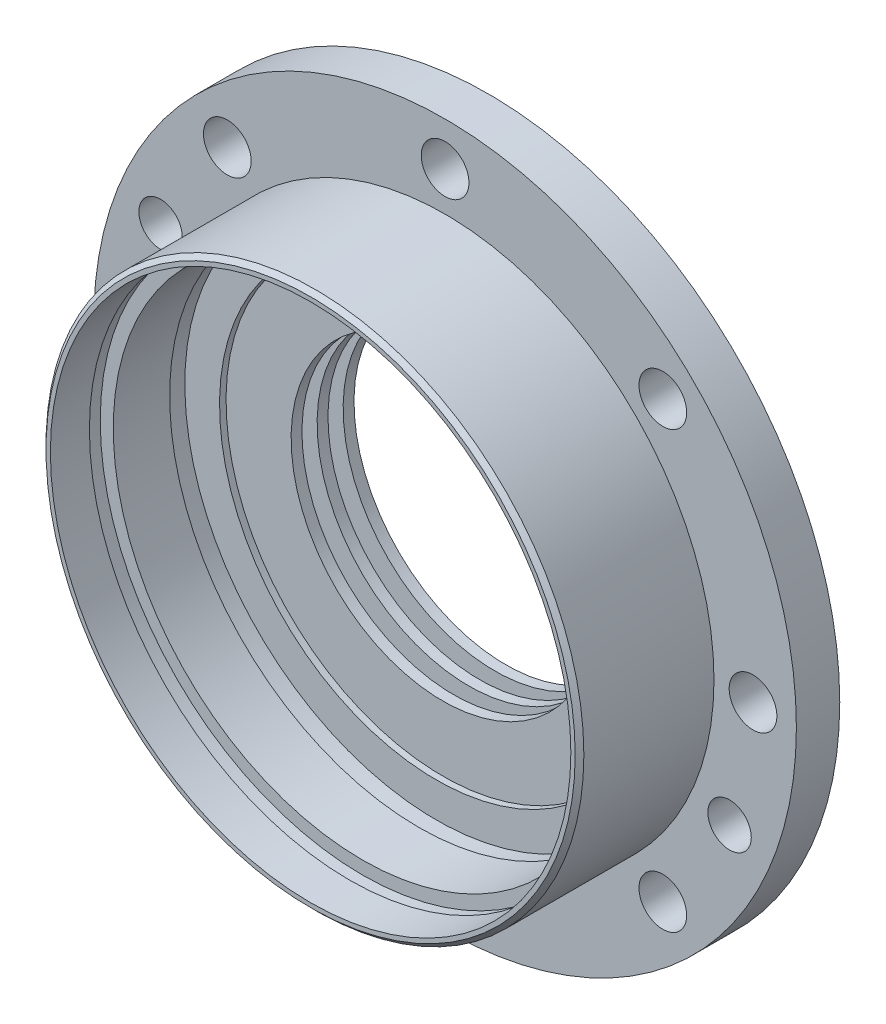
ISO-10303-21;
HEADER;
FILE_DESCRIPTION(('STEP AP214'),'2;1');
FILE_NAME('part.step','',(''),(''),'','','');
FILE_SCHEMA(('AUTOMOTIVE_DESIGN { 1 0 10303 214 1 1 1 1 }'));
ENDSEC;
DATA;
#1=APPLICATION_CONTEXT('core data for automotive mechanical design processes');
#2=APPLICATION_PROTOCOL_DEFINITION('international standard','automotive_design',2000,#1);
#3=PRODUCT_CONTEXT('',#1,'mechanical');
#4=PRODUCT('Part','Part','',(#3));
#5=PRODUCT_RELATED_PRODUCT_CATEGORY('part','',(#4));
#6=PRODUCT_DEFINITION_FORMATION('','',#4);
#7=PRODUCT_DEFINITION_CONTEXT('part definition',#1,'design');
#8=PRODUCT_DEFINITION('design','',#6,#7);
#9=PRODUCT_DEFINITION_SHAPE('','',#8);
#10=(LENGTH_UNIT() NAMED_UNIT(*) SI_UNIT(.MILLI.,.METRE.));
#11=(NAMED_UNIT(*) PLANE_ANGLE_UNIT() SI_UNIT($,.RADIAN.));
#12=(NAMED_UNIT(*) SI_UNIT($,.STERADIAN.) SOLID_ANGLE_UNIT());
#13=UNCERTAINTY_MEASURE_WITH_UNIT(LENGTH_MEASURE(1.E-05),#10,'distance_accuracy_value','');
#14=(GEOMETRIC_REPRESENTATION_CONTEXT(3) GLOBAL_UNCERTAINTY_ASSIGNED_CONTEXT((#13)) GLOBAL_UNIT_ASSIGNED_CONTEXT((#10,
#11,#12)) REPRESENTATION_CONTEXT('',''));
#15=CARTESIAN_POINT('',(0.,0.,0.));
#16=DIRECTION('',(0.,0.,1.));
#17=DIRECTION('',(1.,0.,0.));
#18=AXIS2_PLACEMENT_3D('',#15,#16,#17);
#19=CARTESIAN_POINT('',(0.,0.,4.));
#20=DIRECTION('',(0.,0.,-1.));
#21=DIRECTION('',(-1.,0.,0.));
#22=AXIS2_PLACEMENT_3D('',#19,#20,#21);
#23=CYLINDRICAL_SURFACE('',#22,55.);
#24=CARTESIAN_POINT('',(0.,0.,4.));
#25=DIRECTION('',(0.,0.,1.));
#26=DIRECTION('',(1.,0.,0.));
#27=AXIS2_PLACEMENT_3D('',#24,#25,#26);
#28=CIRCLE('',#27,55.);
#29=CARTESIAN_POINT('',(55.,0.,4.));
#30=VERTEX_POINT('',#29);
#31=EDGE_CURVE('E51',#30,#30,#28,.T.);
#32=ORIENTED_EDGE('',*,*,#31,.F.);
#33=EDGE_LOOP('',(#32));
#34=FACE_BOUND('',#33,.T.);
#35=CARTESIAN_POINT('',(0.,0.,0.));
#36=DIRECTION('',(0.,0.,1.));
#37=DIRECTION('',(1.,0.,0.));
#38=AXIS2_PLACEMENT_3D('',#35,#36,#37);
#39=CIRCLE('',#38,55.);
#40=CARTESIAN_POINT('',(55.,0.,0.));
#41=VERTEX_POINT('',#40);
#42=EDGE_CURVE('E55',#41,#41,#39,.T.);
#43=ORIENTED_EDGE('',*,*,#42,.T.);
#44=EDGE_LOOP('',(#43));
#45=FACE_BOUND('',#44,.T.);
#46=ADVANCED_FACE('F39',(#34,#45),#23,.T.);
#47=CARTESIAN_POINT('',(0.,0.,0.));
#48=DIRECTION('',(0.,0.,1.));
#49=DIRECTION('',(1.,0.,0.));
#50=AXIS2_PLACEMENT_3D('',#47,#48,#49);
#51=PLANE('',#50);
#52=CARTESIAN_POINT('',(0.,0.,0.));
#53=DIRECTION('',(0.,0.,-1.));
#54=DIRECTION('',(0.,1.,0.));
#55=AXIS2_PLACEMENT_3D('',#52,#53,#54);
#56=CIRCLE('',#55,35.);
#57=CARTESIAN_POINT('',(0.,35.,0.));
#58=VERTEX_POINT('',#57);
#59=EDGE_CURVE('E126',#58,#58,#56,.T.);
#60=ORIENTED_EDGE('',*,*,#59,.F.);
#61=EDGE_LOOP('',(#60));
#62=FACE_BOUND('',#61,.T.);
#63=ORIENTED_EDGE('',*,*,#42,.F.);
#64=EDGE_LOOP('',(#63));
#65=FACE_BOUND('',#64,.T.);
#66=ADVANCED_FACE('F222',(#62,#65),#51,.F.);
#67=CARTESIAN_POINT('',(0.,0.,14.));
#68=DIRECTION('',(0.,0.,-1.));
#69=DIRECTION('',(-1.,0.,0.));
#70=AXIS2_PLACEMENT_3D('',#67,#68,#69);
#71=CYLINDRICAL_SURFACE('',#70,81.);
#72=CARTESIAN_POINT('',(0.,0.,14.));
#73=DIRECTION('',(0.,0.,1.));
#74=DIRECTION('',(1.,0.,0.));
#75=AXIS2_PLACEMENT_3D('',#72,#73,#74);
#76=CIRCLE('',#75,81.);
#77=CARTESIAN_POINT('',(81.,0.,14.));
#78=VERTEX_POINT('',#77);
#79=EDGE_CURVE('E59',#78,#78,#76,.T.);
#80=ORIENTED_EDGE('',*,*,#79,.F.);
#81=EDGE_LOOP('',(#80));
#82=FACE_BOUND('',#81,.T.);
#83=CARTESIAN_POINT('',(0.,0.,4.));
#84=DIRECTION('',(0.,0.,1.));
#85=DIRECTION('',(1.,0.,0.));
#86=AXIS2_PLACEMENT_3D('',#83,#84,#85);
#87=CIRCLE('',#86,81.);
#88=CARTESIAN_POINT('',(81.,0.,4.));
#89=VERTEX_POINT('',#88);
#90=EDGE_CURVE('E61',#89,#89,#87,.T.);
#91=ORIENTED_EDGE('',*,*,#90,.T.);
#92=EDGE_LOOP('',(#91));
#93=FACE_BOUND('',#92,.T.);
#94=ADVANCED_FACE('F196',(#82,#93),#71,.T.);
#95=CARTESIAN_POINT('',(0.,0.,14.));
#96=DIRECTION('',(0.,0.,1.));
#97=DIRECTION('',(1.,0.,0.));
#98=AXIS2_PLACEMENT_3D('',#95,#96,#97);
#99=PLANE('',#98);
#100=CARTESIAN_POINT('',(65.5954468083016,-27.170523697921,14.));
#101=DIRECTION('',(0.,0.,1.));
#102=DIRECTION('',(1.,0.,0.));
#103=AXIS2_PLACEMENT_3D('',#100,#101,#102);
#104=CIRCLE('',#103,5.00000000000002);
#105=CARTESIAN_POINT('',(70.5954468083016,-27.170523697921,14.));
#106=VERTEX_POINT('',#105);
#107=EDGE_CURVE('E186',#106,#106,#104,.T.);
#108=ORIENTED_EDGE('',*,*,#107,.F.);
#109=EDGE_LOOP('',(#108));
#110=FACE_BOUND('',#109,.T.);
#111=CARTESIAN_POINT('',(-65.5954468083015,27.170523697921,14.));
#112=DIRECTION('',(0.,0.,1.));
#113=DIRECTION('',(1.,0.,0.));
#114=AXIS2_PLACEMENT_3D('',#111,#112,#113);
#115=CIRCLE('',#114,5.00000000000001);
#116=CARTESIAN_POINT('',(-60.5954468083015,27.170523697921,14.));
#117=VERTEX_POINT('',#116);
#118=EDGE_CURVE('E180',#117,#117,#115,.T.);
#119=ORIENTED_EDGE('',*,*,#118,.F.);
#120=EDGE_LOOP('',(#119));
#121=FACE_BOUND('',#120,.T.);
#122=CARTESIAN_POINT('',(-50.2045814642455,50.2045814642443,14.));
#123=DIRECTION('',(0.,0.,1.));
#124=DIRECTION('',(1.,0.,0.));
#125=AXIS2_PLACEMENT_3D('',#122,#123,#124);
#126=CIRCLE('',#125,5.50000000000001);
#127=CARTESIAN_POINT('',(-44.7045814642455,50.2045814642443,14.));
#128=VERTEX_POINT('',#127);
#129=EDGE_CURVE('E174',#128,#128,#126,.T.);
#130=ORIENTED_EDGE('',*,*,#129,.F.);
#131=EDGE_LOOP('',(#130));
#132=FACE_BOUND('',#131,.T.);
#133=CARTESIAN_POINT('',(-7.43685525173587E-13,71.,14.));
#134=DIRECTION('',(0.,0.,1.));
#135=DIRECTION('',(1.,0.,0.));
#136=AXIS2_PLACEMENT_3D('',#133,#134,#135);
#137=CIRCLE('',#136,5.50000000000001);
#138=CARTESIAN_POINT('',(5.49999999999927,71.,14.));
#139=VERTEX_POINT('',#138);
#140=EDGE_CURVE('E168',#139,#139,#137,.T.);
#141=ORIENTED_EDGE('',*,*,#140,.F.);
#142=EDGE_LOOP('',(#141));
#143=FACE_BOUND('',#142,.T.);
#144=CARTESIAN_POINT('',(50.2045814642444,50.2045814642453,14.));
#145=DIRECTION('',(0.,0.,1.));
#146=DIRECTION('',(1.,0.,0.));
#147=AXIS2_PLACEMENT_3D('',#144,#145,#146);
#148=CIRCLE('',#147,5.50000000000001);
#149=CARTESIAN_POINT('',(55.7045814642444,50.2045814642453,14.));
#150=VERTEX_POINT('',#149);
#151=EDGE_CURVE('E162',#150,#150,#148,.T.);
#152=ORIENTED_EDGE('',*,*,#151,.F.);
#153=EDGE_LOOP('',(#152));
#154=FACE_BOUND('',#153,.T.);
#155=CARTESIAN_POINT('',(71.,0.,14.));
#156=DIRECTION('',(0.,0.,1.));
#157=DIRECTION('',(1.,0.,0.));
#158=AXIS2_PLACEMENT_3D('',#155,#156,#157);
#159=CIRCLE('',#158,5.50000000000002);
#160=CARTESIAN_POINT('',(76.5,0.,14.));
#161=VERTEX_POINT('',#160);
#162=EDGE_CURVE('E156',#161,#161,#159,.T.);
#163=ORIENTED_EDGE('',*,*,#162,.F.);
#164=EDGE_LOOP('',(#163));
#165=FACE_BOUND('',#164,.T.);
#166=CARTESIAN_POINT('',(50.2045814642451,-50.2045814642446,14.));
#167=DIRECTION('',(0.,0.,1.));
#168=DIRECTION('',(1.,0.,0.));
#169=AXIS2_PLACEMENT_3D('',#166,#167,#168);
#170=CIRCLE('',#169,5.50000000000001);
#171=CARTESIAN_POINT('',(55.7045814642451,-50.2045814642446,14.));
#172=VERTEX_POINT('',#171);
#173=EDGE_CURVE('E150',#172,#172,#170,.T.);
#174=ORIENTED_EDGE('',*,*,#173,.F.);
#175=EDGE_LOOP('',(#174));
#176=FACE_BOUND('',#175,.T.);
#177=CARTESIAN_POINT('',(2.47895175057862E-13,-71.,14.));
#178=DIRECTION('',(0.,0.,1.));
#179=DIRECTION('',(1.,0.,0.));
#180=AXIS2_PLACEMENT_3D('',#177,#178,#179);
#181=CIRCLE('',#180,5.50000000000001);
#182=CARTESIAN_POINT('',(5.50000000000026,-71.,14.));
#183=VERTEX_POINT('',#182);
#184=EDGE_CURVE('E144',#183,#183,#181,.T.);
#185=ORIENTED_EDGE('',*,*,#184,.F.);
#186=EDGE_LOOP('',(#185));
#187=FACE_BOUND('',#186,.T.);
#188=CARTESIAN_POINT('',(-50.2045814642448,-50.204581464245,14.));
#189=DIRECTION('',(0.,0.,1.));
#190=DIRECTION('',(1.,0.,0.));
#191=AXIS2_PLACEMENT_3D('',#188,#189,#190);
#192=CIRCLE('',#191,5.50000000000001);
#193=CARTESIAN_POINT('',(-44.7045814642448,-50.204581464245,14.));
#194=VERTEX_POINT('',#193);
#195=EDGE_CURVE('E138',#194,#194,#192,.T.);
#196=ORIENTED_EDGE('',*,*,#195,.F.);
#197=EDGE_LOOP('',(#196));
#198=FACE_BOUND('',#197,.T.);
#199=CARTESIAN_POINT('',(-71.,0.,14.));
#200=DIRECTION('',(0.,0.,1.));
#201=DIRECTION('',(1.,0.,0.));
#202=AXIS2_PLACEMENT_3D('',#199,#200,#201);
#203=CIRCLE('',#202,5.50000000000002);
#204=CARTESIAN_POINT('',(-65.5,0.,14.));
#205=VERTEX_POINT('',#204);
#206=EDGE_CURVE('E132',#205,#205,#203,.T.);
#207=ORIENTED_EDGE('',*,*,#206,.F.);
#208=EDGE_LOOP('',(#207));
#209=FACE_BOUND('',#208,.T.);
#210=CARTESIAN_POINT('',(0.,0.,14.));
#211=DIRECTION('',(0.,0.,1.));
#212=DIRECTION('',(1.,0.,0.));
#213=AXIS2_PLACEMENT_3D('',#210,#211,#212);
#214=CIRCLE('',#213,62.);
#215=CARTESIAN_POINT('',(62.,0.,14.));
#216=VERTEX_POINT('',#215);
#217=EDGE_CURVE('E64',#216,#216,#214,.F.);
#218=ORIENTED_EDGE('',*,*,#217,.T.);
#219=EDGE_LOOP('',(#218));
#220=FACE_BOUND('',#219,.T.);
#221=ORIENTED_EDGE('',*,*,#79,.T.);
#222=EDGE_LOOP('',(#221));
#223=FACE_BOUND('',#222,.T.);
#224=ADVANCED_FACE('F192',(#110,#121,#132,#143,#154,#165,#176,#187,#198,#209,#220,#223),#99,.T.);
#225=CARTESIAN_POINT('',(0.,0.,4.));
#226=DIRECTION('',(0.,0.,1.));
#227=DIRECTION('',(1.,0.,0.));
#228=AXIS2_PLACEMENT_3D('',#225,#226,#227);
#229=PLANE('',#228);
#230=CARTESIAN_POINT('',(65.5954468083016,-27.170523697921,4.));
#231=DIRECTION('',(0.,0.,1.));
#232=DIRECTION('',(1.,0.,0.));
#233=AXIS2_PLACEMENT_3D('',#230,#231,#232);
#234=CIRCLE('',#233,5.00000000000002);
#235=CARTESIAN_POINT('',(70.5954468083016,-27.170523697921,4.));
#236=VERTEX_POINT('',#235);
#237=EDGE_CURVE('E183',#236,#236,#234,.T.);
#238=ORIENTED_EDGE('',*,*,#237,.T.);
#239=EDGE_LOOP('',(#238));
#240=FACE_BOUND('',#239,.T.);
#241=CARTESIAN_POINT('',(-65.5954468083015,27.170523697921,4.));
#242=DIRECTION('',(0.,0.,1.));
#243=DIRECTION('',(1.,0.,0.));
#244=AXIS2_PLACEMENT_3D('',#241,#242,#243);
#245=CIRCLE('',#244,5.00000000000001);
#246=CARTESIAN_POINT('',(-60.5954468083015,27.170523697921,4.));
#247=VERTEX_POINT('',#246);
#248=EDGE_CURVE('E177',#247,#247,#245,.T.);
#249=ORIENTED_EDGE('',*,*,#248,.T.);
#250=EDGE_LOOP('',(#249));
#251=FACE_BOUND('',#250,.T.);
#252=CARTESIAN_POINT('',(-50.2045814642455,50.2045814642443,4.));
#253=DIRECTION('',(0.,0.,1.));
#254=DIRECTION('',(1.,0.,0.));
#255=AXIS2_PLACEMENT_3D('',#252,#253,#254);
#256=CIRCLE('',#255,5.50000000000001);
#257=CARTESIAN_POINT('',(-44.7045814642455,50.2045814642443,4.));
#258=VERTEX_POINT('',#257);
#259=EDGE_CURVE('E171',#258,#258,#256,.T.);
#260=ORIENTED_EDGE('',*,*,#259,.T.);
#261=EDGE_LOOP('',(#260));
#262=FACE_BOUND('',#261,.T.);
#263=CARTESIAN_POINT('',(-7.43685525173587E-13,71.,4.));
#264=DIRECTION('',(0.,0.,1.));
#265=DIRECTION('',(1.,0.,0.));
#266=AXIS2_PLACEMENT_3D('',#263,#264,#265);
#267=CIRCLE('',#266,5.50000000000001);
#268=CARTESIAN_POINT('',(5.49999999999927,71.,4.));
#269=VERTEX_POINT('',#268);
#270=EDGE_CURVE('E165',#269,#269,#267,.T.);
#271=ORIENTED_EDGE('',*,*,#270,.T.);
#272=EDGE_LOOP('',(#271));
#273=FACE_BOUND('',#272,.T.);
#274=CARTESIAN_POINT('',(50.2045814642444,50.2045814642453,4.));
#275=DIRECTION('',(0.,0.,1.));
#276=DIRECTION('',(1.,0.,0.));
#277=AXIS2_PLACEMENT_3D('',#274,#275,#276);
#278=CIRCLE('',#277,5.50000000000001);
#279=CARTESIAN_POINT('',(55.7045814642444,50.2045814642453,4.));
#280=VERTEX_POINT('',#279);
#281=EDGE_CURVE('E159',#280,#280,#278,.T.);
#282=ORIENTED_EDGE('',*,*,#281,.T.);
#283=EDGE_LOOP('',(#282));
#284=FACE_BOUND('',#283,.T.);
#285=CARTESIAN_POINT('',(71.,0.,4.));
#286=DIRECTION('',(0.,0.,1.));
#287=DIRECTION('',(1.,0.,0.));
#288=AXIS2_PLACEMENT_3D('',#285,#286,#287);
#289=CIRCLE('',#288,5.50000000000002);
#290=CARTESIAN_POINT('',(76.5,0.,4.));
#291=VERTEX_POINT('',#290);
#292=EDGE_CURVE('E153',#291,#291,#289,.T.);
#293=ORIENTED_EDGE('',*,*,#292,.T.);
#294=EDGE_LOOP('',(#293));
#295=FACE_BOUND('',#294,.T.);
#296=CARTESIAN_POINT('',(50.2045814642451,-50.2045814642446,4.));
#297=DIRECTION('',(0.,0.,1.));
#298=DIRECTION('',(1.,0.,0.));
#299=AXIS2_PLACEMENT_3D('',#296,#297,#298);
#300=CIRCLE('',#299,5.50000000000001);
#301=CARTESIAN_POINT('',(55.7045814642451,-50.2045814642446,4.));
#302=VERTEX_POINT('',#301);
#303=EDGE_CURVE('E147',#302,#302,#300,.T.);
#304=ORIENTED_EDGE('',*,*,#303,.T.);
#305=EDGE_LOOP('',(#304));
#306=FACE_BOUND('',#305,.T.);
#307=CARTESIAN_POINT('',(2.47895175057862E-13,-71.,4.));
#308=DIRECTION('',(0.,0.,1.));
#309=DIRECTION('',(1.,0.,0.));
#310=AXIS2_PLACEMENT_3D('',#307,#308,#309);
#311=CIRCLE('',#310,5.50000000000001);
#312=CARTESIAN_POINT('',(5.50000000000026,-71.,4.));
#313=VERTEX_POINT('',#312);
#314=EDGE_CURVE('E141',#313,#313,#311,.T.);
#315=ORIENTED_EDGE('',*,*,#314,.T.);
#316=EDGE_LOOP('',(#315));
#317=FACE_BOUND('',#316,.T.);
#318=CARTESIAN_POINT('',(-50.2045814642448,-50.204581464245,4.));
#319=DIRECTION('',(0.,0.,1.));
#320=DIRECTION('',(1.,0.,0.));
#321=AXIS2_PLACEMENT_3D('',#318,#319,#320);
#322=CIRCLE('',#321,5.50000000000001);
#323=CARTESIAN_POINT('',(-44.7045814642448,-50.204581464245,4.));
#324=VERTEX_POINT('',#323);
#325=EDGE_CURVE('E135',#324,#324,#322,.T.);
#326=ORIENTED_EDGE('',*,*,#325,.T.);
#327=EDGE_LOOP('',(#326));
#328=FACE_BOUND('',#327,.T.);
#329=CARTESIAN_POINT('',(-71.,0.,4.));
#330=DIRECTION('',(0.,0.,1.));
#331=DIRECTION('',(1.,0.,0.));
#332=AXIS2_PLACEMENT_3D('',#329,#330,#331);
#333=CIRCLE('',#332,5.50000000000002);
#334=CARTESIAN_POINT('',(-65.5,0.,4.));
#335=VERTEX_POINT('',#334);
#336=EDGE_CURVE('E129',#335,#335,#333,.T.);
#337=ORIENTED_EDGE('',*,*,#336,.T.);
#338=EDGE_LOOP('',(#337));
#339=FACE_BOUND('',#338,.T.);
#340=ORIENTED_EDGE('',*,*,#31,.T.);
#341=EDGE_LOOP('',(#340));
#342=FACE_BOUND('',#341,.T.);
#343=ORIENTED_EDGE('',*,*,#90,.F.);
#344=EDGE_LOOP('',(#343));
#345=FACE_BOUND('',#344,.T.);
#346=ADVANCED_FACE('F195',(#240,#251,#262,#273,#284,#295,#306,#317,#328,#339,#342,#345),#229,.F.);
#347=CARTESIAN_POINT('',(0.,0.,-161.362481734264));
#348=DIRECTION('',(0.,0.,1.));
#349=DIRECTION('',(1.,0.,0.));
#350=AXIS2_PLACEMENT_3D('',#347,#348,#349);
#351=CYLINDRICAL_SURFACE('',#350,62.);
#352=CARTESIAN_POINT('',(0.,0.,44.));
#353=DIRECTION('',(0.,0.,1.));
#354=DIRECTION('',(1.,0.,0.));
#355=AXIS2_PLACEMENT_3D('',#352,#353,#354);
#356=CIRCLE('',#355,62.);
#357=CARTESIAN_POINT('',(62.,0.,44.));
#358=VERTEX_POINT('',#357);
#359=EDGE_CURVE('E10',#358,#358,#356,.F.);
#360=ORIENTED_EDGE('',*,*,#359,.T.);
#361=EDGE_LOOP('',(#360));
#362=FACE_BOUND('',#361,.T.);
#363=ORIENTED_EDGE('',*,*,#217,.F.);
#364=EDGE_LOOP('',(#363));
#365=FACE_BOUND('',#364,.T.);
#366=ADVANCED_FACE('F227',(#362,#365),#351,.T.);
#367=CARTESIAN_POINT('',(0.,0.,45.));
#368=DIRECTION('',(0.,0.,1.));
#369=DIRECTION('',(1.,0.,0.));
#370=AXIS2_PLACEMENT_3D('',#367,#368,#369);
#371=PLANE('',#370);
#372=CARTESIAN_POINT('',(0.,0.,45.));
#373=DIRECTION('',(0.,0.,1.));
#374=DIRECTION('',(1.,0.,0.));
#375=AXIS2_PLACEMENT_3D('',#372,#373,#374);
#376=CIRCLE('',#375,61.);
#377=CARTESIAN_POINT('',(61.,0.,45.));
#378=VERTEX_POINT('',#377);
#379=EDGE_CURVE('E47',#378,#378,#376,.T.);
#380=ORIENTED_EDGE('',*,*,#379,.T.);
#381=EDGE_LOOP('',(#380));
#382=FACE_BOUND('',#381,.T.);
#383=CARTESIAN_POINT('',(0.,0.,45.));
#384=DIRECTION('',(0.,0.,-1.));
#385=DIRECTION('',(0.,1.,0.));
#386=AXIS2_PLACEMENT_3D('',#383,#384,#385);
#387=CIRCLE('',#386,60.);
#388=CARTESIAN_POINT('',(0.,60.,45.));
#389=VERTEX_POINT('',#388);
#390=EDGE_CURVE('E69',#389,#389,#387,.T.);
#391=ORIENTED_EDGE('',*,*,#390,.T.);
#392=EDGE_LOOP('',(#391));
#393=FACE_BOUND('',#392,.T.);
#394=ADVANCED_FACE('F234',(#382,#393),#371,.T.);
#395=CARTESIAN_POINT('',(0.,0.,-13.139169211157));
#396=DIRECTION('',(0.,0.,-1.));
#397=DIRECTION('',(0.,1.,0.));
#398=AXIS2_PLACEMENT_3D('',#395,#396,#397);
#399=CYLINDRICAL_SURFACE('',#398,60.);
#400=CARTESIAN_POINT('',(0.,0.,36.));
#401=DIRECTION('',(0.,0.,-1.));
#402=DIRECTION('',(0.,1.,0.));
#403=AXIS2_PLACEMENT_3D('',#400,#401,#402);
#404=CIRCLE('',#403,60.);
#405=CARTESIAN_POINT('',(0.,60.,36.));
#406=VERTEX_POINT('',#405);
#407=EDGE_CURVE('E72',#406,#406,#404,.T.);
#408=ORIENTED_EDGE('',*,*,#407,.T.);
#409=EDGE_LOOP('',(#408));
#410=FACE_BOUND('',#409,.T.);
#411=ORIENTED_EDGE('',*,*,#390,.F.);
#412=EDGE_LOOP('',(#411));
#413=FACE_BOUND('',#412,.T.);
#414=ADVANCED_FACE('F360',(#410,#413),#399,.F.);
#415=CARTESIAN_POINT('',(0.,-60.,36.));
#416=DIRECTION('',(0.,0.,-1.));
#417=DIRECTION('',(0.,1.,0.));
#418=AXIS2_PLACEMENT_3D('',#415,#416,#417);
#419=PLANE('',#418);
#420=CARTESIAN_POINT('',(0.,0.,36.));
#421=DIRECTION('',(0.,0.,-1.));
#422=DIRECTION('',(0.,1.,0.));
#423=AXIS2_PLACEMENT_3D('',#420,#421,#422);
#424=CIRCLE('',#423,60.5);
#425=CARTESIAN_POINT('',(0.,60.5,36.));
#426=VERTEX_POINT('',#425);
#427=EDGE_CURVE('E75',#426,#426,#424,.T.);
#428=ORIENTED_EDGE('',*,*,#427,.T.);
#429=EDGE_LOOP('',(#428));
#430=FACE_BOUND('',#429,.T.);
#431=ORIENTED_EDGE('',*,*,#407,.F.);
#432=EDGE_LOOP('',(#431));
#433=FACE_BOUND('',#432,.T.);
#434=ADVANCED_FACE('F354',(#430,#433),#419,.T.);
#435=CARTESIAN_POINT('',(0.,0.,-13.139169211157));
#436=DIRECTION('',(0.,0.,-1.));
#437=DIRECTION('',(0.,1.,0.));
#438=AXIS2_PLACEMENT_3D('',#435,#436,#437);
#439=CYLINDRICAL_SURFACE('',#438,60.5);
#440=CARTESIAN_POINT('',(0.,0.,33.));
#441=DIRECTION('',(0.,0.,-1.));
#442=DIRECTION('',(0.,1.,0.));
#443=AXIS2_PLACEMENT_3D('',#440,#441,#442);
#444=CIRCLE('',#443,60.5);
#445=CARTESIAN_POINT('',(0.,60.5,33.));
#446=VERTEX_POINT('',#445);
#447=EDGE_CURVE('E78',#446,#446,#444,.T.);
#448=ORIENTED_EDGE('',*,*,#447,.T.);
#449=EDGE_LOOP('',(#448));
#450=FACE_BOUND('',#449,.T.);
#451=ORIENTED_EDGE('',*,*,#427,.F.);
#452=EDGE_LOOP('',(#451));
#453=FACE_BOUND('',#452,.T.);
#454=ADVANCED_FACE('F348',(#450,#453),#439,.F.);
#455=CARTESIAN_POINT('',(0.,-60.5,33.));
#456=DIRECTION('',(0.,0.,1.));
#457=DIRECTION('',(0.,-1.,0.));
#458=AXIS2_PLACEMENT_3D('',#455,#456,#457);
#459=PLANE('',#458);
#460=CARTESIAN_POINT('',(0.,0.,33.));
#461=DIRECTION('',(0.,0.,-1.));
#462=DIRECTION('',(0.,1.,0.));
#463=AXIS2_PLACEMENT_3D('',#460,#461,#462);
#464=CIRCLE('',#463,57.5);
#465=CARTESIAN_POINT('',(0.,57.5,33.));
#466=VERTEX_POINT('',#465);
#467=EDGE_CURVE('E81',#466,#466,#464,.T.);
#468=ORIENTED_EDGE('',*,*,#467,.T.);
#469=EDGE_LOOP('',(#468));
#470=FACE_BOUND('',#469,.T.);
#471=ORIENTED_EDGE('',*,*,#447,.F.);
#472=EDGE_LOOP('',(#471));
#473=FACE_BOUND('',#472,.T.);
#474=ADVANCED_FACE('F342',(#470,#473),#459,.T.);
#475=CARTESIAN_POINT('',(0.,0.,-13.139169211157));
#476=DIRECTION('',(0.,0.,-1.));
#477=DIRECTION('',(0.,1.,0.));
#478=AXIS2_PLACEMENT_3D('',#475,#476,#477);
#479=CYLINDRICAL_SURFACE('',#478,57.5);
#480=CARTESIAN_POINT('',(0.,0.,20.));
#481=DIRECTION('',(0.,0.,-1.));
#482=DIRECTION('',(0.,1.,0.));
#483=AXIS2_PLACEMENT_3D('',#480,#481,#482);
#484=CIRCLE('',#483,57.5);
#485=CARTESIAN_POINT('',(0.,57.5,20.));
#486=VERTEX_POINT('',#485);
#487=EDGE_CURVE('E84',#486,#486,#484,.T.);
#488=ORIENTED_EDGE('',*,*,#487,.T.);
#489=EDGE_LOOP('',(#488));
#490=FACE_BOUND('',#489,.T.);
#491=ORIENTED_EDGE('',*,*,#467,.F.);
#492=EDGE_LOOP('',(#491));
#493=FACE_BOUND('',#492,.T.);
#494=ADVANCED_FACE('F336',(#490,#493),#479,.F.);
#495=CARTESIAN_POINT('',(0.,-57.5,20.));
#496=DIRECTION('',(0.,0.,-1.));
#497=DIRECTION('',(0.,1.,0.));
#498=AXIS2_PLACEMENT_3D('',#495,#496,#497);
#499=PLANE('',#498);
#500=CARTESIAN_POINT('',(0.,0.,20.));
#501=DIRECTION('',(0.,0.,-1.));
#502=DIRECTION('',(0.,1.,0.));
#503=AXIS2_PLACEMENT_3D('',#500,#501,#502);
#504=CIRCLE('',#503,58.);
#505=CARTESIAN_POINT('',(0.,58.,20.));
#506=VERTEX_POINT('',#505);
#507=EDGE_CURVE('E87',#506,#506,#504,.T.);
#508=ORIENTED_EDGE('',*,*,#507,.T.);
#509=EDGE_LOOP('',(#508));
#510=FACE_BOUND('',#509,.T.);
#511=ORIENTED_EDGE('',*,*,#487,.F.);
#512=EDGE_LOOP('',(#511));
#513=FACE_BOUND('',#512,.T.);
#514=ADVANCED_FACE('F330',(#510,#513),#499,.T.);
#515=CARTESIAN_POINT('',(0.,0.,-13.139169211157));
#516=DIRECTION('',(0.,0.,-1.));
#517=DIRECTION('',(0.,1.,0.));
#518=AXIS2_PLACEMENT_3D('',#515,#516,#517);
#519=CYLINDRICAL_SURFACE('',#518,58.);
#520=CARTESIAN_POINT('',(0.,0.,16.));
#521=DIRECTION('',(0.,0.,-1.));
#522=DIRECTION('',(0.,1.,0.));
#523=AXIS2_PLACEMENT_3D('',#520,#521,#522);
#524=CIRCLE('',#523,58.);
#525=CARTESIAN_POINT('',(0.,58.,16.));
#526=VERTEX_POINT('',#525);
#527=EDGE_CURVE('E90',#526,#526,#524,.T.);
#528=ORIENTED_EDGE('',*,*,#527,.T.);
#529=EDGE_LOOP('',(#528));
#530=FACE_BOUND('',#529,.T.);
#531=ORIENTED_EDGE('',*,*,#507,.F.);
#532=EDGE_LOOP('',(#531));
#533=FACE_BOUND('',#532,.T.);
#534=ADVANCED_FACE('F324',(#530,#533),#519,.F.);
#535=CARTESIAN_POINT('',(0.,-58.,16.));
#536=DIRECTION('',(0.,0.,1.));
#537=DIRECTION('',(0.,-1.,0.));
#538=AXIS2_PLACEMENT_3D('',#535,#536,#537);
#539=PLANE('',#538);
#540=CARTESIAN_POINT('',(0.,0.,16.));
#541=DIRECTION('',(0.,0.,-1.));
#542=DIRECTION('',(0.,1.,0.));
#543=AXIS2_PLACEMENT_3D('',#540,#541,#542);
#544=CIRCLE('',#543,50.);
#545=CARTESIAN_POINT('',(0.,50.,16.));
#546=VERTEX_POINT('',#545);
#547=EDGE_CURVE('E93',#546,#546,#544,.T.);
#548=ORIENTED_EDGE('',*,*,#547,.T.);
#549=EDGE_LOOP('',(#548));
#550=FACE_BOUND('',#549,.T.);
#551=ORIENTED_EDGE('',*,*,#527,.F.);
#552=EDGE_LOOP('',(#551));
#553=FACE_BOUND('',#552,.T.);
#554=ADVANCED_FACE('F318',(#550,#553),#539,.T.);
#555=CARTESIAN_POINT('',(0.,0.,-13.139169211157));
#556=DIRECTION('',(0.,0.,-1.));
#557=DIRECTION('',(0.,1.,0.));
#558=AXIS2_PLACEMENT_3D('',#555,#556,#557);
#559=CYLINDRICAL_SURFACE('',#558,50.);
#560=CARTESIAN_POINT('',(0.,0.,14.5));
#561=DIRECTION('',(0.,0.,-1.));
#562=DIRECTION('',(0.,1.,0.));
#563=AXIS2_PLACEMENT_3D('',#560,#561,#562);
#564=CIRCLE('',#563,50.);
#565=CARTESIAN_POINT('',(0.,50.,14.5));
#566=VERTEX_POINT('',#565);
#567=EDGE_CURVE('E96',#566,#566,#564,.T.);
#568=ORIENTED_EDGE('',*,*,#567,.T.);
#569=EDGE_LOOP('',(#568));
#570=FACE_BOUND('',#569,.T.);
#571=ORIENTED_EDGE('',*,*,#547,.F.);
#572=EDGE_LOOP('',(#571));
#573=FACE_BOUND('',#572,.T.);
#574=ADVANCED_FACE('F312',(#570,#573),#559,.F.);
#575=CARTESIAN_POINT('',(0.,-50.,14.5));
#576=DIRECTION('',(0.,0.,1.));
#577=DIRECTION('',(0.,-1.,0.));
#578=AXIS2_PLACEMENT_3D('',#575,#576,#577);
#579=PLANE('',#578);
#580=CARTESIAN_POINT('',(0.,0.,14.5));
#581=DIRECTION('',(0.,0.,-1.));
#582=DIRECTION('',(0.,1.,0.));
#583=AXIS2_PLACEMENT_3D('',#580,#581,#582);
#584=CIRCLE('',#583,35.);
#585=CARTESIAN_POINT('',(0.,35.,14.5));
#586=VERTEX_POINT('',#585);
#587=EDGE_CURVE('E99',#586,#586,#584,.T.);
#588=ORIENTED_EDGE('',*,*,#587,.T.);
#589=EDGE_LOOP('',(#588));
#590=FACE_BOUND('',#589,.T.);
#591=ORIENTED_EDGE('',*,*,#567,.F.);
#592=EDGE_LOOP('',(#591));
#593=FACE_BOUND('',#592,.T.);
#594=ADVANCED_FACE('F306',(#590,#593),#579,.T.);
#595=CARTESIAN_POINT('',(0.,0.,-13.139169211157));
#596=DIRECTION('',(0.,0.,-1.));
#597=DIRECTION('',(0.,1.,0.));
#598=AXIS2_PLACEMENT_3D('',#595,#596,#597);
#599=CYLINDRICAL_SURFACE('',#598,35.);
#600=CARTESIAN_POINT('',(0.,0.,12.));
#601=DIRECTION('',(0.,0.,-1.));
#602=DIRECTION('',(0.,1.,0.));
#603=AXIS2_PLACEMENT_3D('',#600,#601,#602);
#604=CIRCLE('',#603,35.);
#605=CARTESIAN_POINT('',(0.,35.,12.));
#606=VERTEX_POINT('',#605);
#607=EDGE_CURVE('E102',#606,#606,#604,.T.);
#608=ORIENTED_EDGE('',*,*,#607,.T.);
#609=EDGE_LOOP('',(#608));
#610=FACE_BOUND('',#609,.T.);
#611=ORIENTED_EDGE('',*,*,#587,.F.);
#612=EDGE_LOOP('',(#611));
#613=FACE_BOUND('',#612,.T.);
#614=ADVANCED_FACE('F300',(#610,#613),#599,.F.);
#615=CARTESIAN_POINT('',(0.,-35.,12.));
#616=DIRECTION('',(0.,0.,-1.));
#617=DIRECTION('',(0.,1.,0.));
#618=AXIS2_PLACEMENT_3D('',#615,#616,#617);
#619=PLANE('',#618);
#620=CARTESIAN_POINT('',(0.,0.,12.));
#621=DIRECTION('',(0.,0.,-1.));
#622=DIRECTION('',(0.,1.,0.));
#623=AXIS2_PLACEMENT_3D('',#620,#621,#622);
#624=CIRCLE('',#623,40.6);
#625=CARTESIAN_POINT('',(0.,40.6,12.));
#626=VERTEX_POINT('',#625);
#627=EDGE_CURVE('E105',#626,#626,#624,.T.);
#628=ORIENTED_EDGE('',*,*,#627,.T.);
#629=EDGE_LOOP('',(#628));
#630=FACE_BOUND('',#629,.T.);
#631=ORIENTED_EDGE('',*,*,#607,.F.);
#632=EDGE_LOOP('',(#631));
#633=FACE_BOUND('',#632,.T.);
#634=ADVANCED_FACE('F294',(#630,#633),#619,.T.);
#635=CARTESIAN_POINT('',(0.,0.,-13.139169211157));
#636=DIRECTION('',(0.,0.,-1.));
#637=DIRECTION('',(0.,1.,0.));
#638=AXIS2_PLACEMENT_3D('',#635,#636,#637);
#639=CYLINDRICAL_SURFACE('',#638,40.6);
#640=CARTESIAN_POINT('',(0.,0.,8.5));
#641=DIRECTION('',(0.,0.,-1.));
#642=DIRECTION('',(0.,1.,0.));
#643=AXIS2_PLACEMENT_3D('',#640,#641,#642);
#644=CIRCLE('',#643,40.6);
#645=CARTESIAN_POINT('',(0.,40.6,8.50000000000001));
#646=VERTEX_POINT('',#645);
#647=EDGE_CURVE('E108',#646,#646,#644,.T.);
#648=ORIENTED_EDGE('',*,*,#647,.T.);
#649=EDGE_LOOP('',(#648));
#650=FACE_BOUND('',#649,.T.);
#651=ORIENTED_EDGE('',*,*,#627,.F.);
#652=EDGE_LOOP('',(#651));
#653=FACE_BOUND('',#652,.T.);
#654=ADVANCED_FACE('F288',(#650,#653),#639,.F.);
#655=CARTESIAN_POINT('',(0.,-40.6,8.5));
#656=DIRECTION('',(0.,0.,1.));
#657=DIRECTION('',(0.,-1.,0.));
#658=AXIS2_PLACEMENT_3D('',#655,#656,#657);
#659=PLANE('',#658);
#660=CARTESIAN_POINT('',(0.,0.,8.5));
#661=DIRECTION('',(0.,0.,-1.));
#662=DIRECTION('',(0.,1.,0.));
#663=AXIS2_PLACEMENT_3D('',#660,#661,#662);
#664=CIRCLE('',#663,35.);
#665=CARTESIAN_POINT('',(0.,35.,8.50000000000001));
#666=VERTEX_POINT('',#665);
#667=EDGE_CURVE('E111',#666,#666,#664,.T.);
#668=ORIENTED_EDGE('',*,*,#667,.T.);
#669=EDGE_LOOP('',(#668));
#670=FACE_BOUND('',#669,.T.);
#671=ORIENTED_EDGE('',*,*,#647,.F.);
#672=EDGE_LOOP('',(#671));
#673=FACE_BOUND('',#672,.T.);
#674=ADVANCED_FACE('F282',(#670,#673),#659,.T.);
#675=CARTESIAN_POINT('',(0.,0.,-13.139169211157));
#676=DIRECTION('',(0.,0.,-1.));
#677=DIRECTION('',(0.,1.,0.));
#678=AXIS2_PLACEMENT_3D('',#675,#676,#677);
#679=CYLINDRICAL_SURFACE('',#678,35.);
#680=CARTESIAN_POINT('',(0.,0.,6.00000000000001));
#681=DIRECTION('',(0.,0.,-1.));
#682=DIRECTION('',(0.,1.,0.));
#683=AXIS2_PLACEMENT_3D('',#680,#681,#682);
#684=CIRCLE('',#683,35.);
#685=CARTESIAN_POINT('',(0.,35.,6.00000000000001));
#686=VERTEX_POINT('',#685);
#687=EDGE_CURVE('E114',#686,#686,#684,.T.);
#688=ORIENTED_EDGE('',*,*,#687,.T.);
#689=EDGE_LOOP('',(#688));
#690=FACE_BOUND('',#689,.T.);
#691=ORIENTED_EDGE('',*,*,#667,.F.);
#692=EDGE_LOOP('',(#691));
#693=FACE_BOUND('',#692,.T.);
#694=ADVANCED_FACE('F276',(#690,#693),#679,.F.);
#695=CARTESIAN_POINT('',(0.,-35.,6.));
#696=DIRECTION('',(0.,0.,-1.));
#697=DIRECTION('',(0.,1.,0.));
#698=AXIS2_PLACEMENT_3D('',#695,#696,#697);
#699=PLANE('',#698);
#700=CARTESIAN_POINT('',(0.,0.,6.));
#701=DIRECTION('',(0.,0.,-1.));
#702=DIRECTION('',(0.,1.,0.));
#703=AXIS2_PLACEMENT_3D('',#700,#701,#702);
#704=CIRCLE('',#703,40.6);
#705=CARTESIAN_POINT('',(0.,40.6,6.00000000000001));
#706=VERTEX_POINT('',#705);
#707=EDGE_CURVE('E117',#706,#706,#704,.T.);
#708=ORIENTED_EDGE('',*,*,#707,.T.);
#709=EDGE_LOOP('',(#708));
#710=FACE_BOUND('',#709,.T.);
#711=ORIENTED_EDGE('',*,*,#687,.F.);
#712=EDGE_LOOP('',(#711));
#713=FACE_BOUND('',#712,.T.);
#714=ADVANCED_FACE('F270',(#710,#713),#699,.T.);
#715=CARTESIAN_POINT('',(0.,0.,-13.139169211157));
#716=DIRECTION('',(0.,0.,-1.));
#717=DIRECTION('',(0.,1.,0.));
#718=AXIS2_PLACEMENT_3D('',#715,#716,#717);
#719=CYLINDRICAL_SURFACE('',#718,40.6);
#720=CARTESIAN_POINT('',(0.,0.,2.5));
#721=DIRECTION('',(0.,0.,-1.));
#722=DIRECTION('',(0.,1.,0.));
#723=AXIS2_PLACEMENT_3D('',#720,#721,#722);
#724=CIRCLE('',#723,40.6);
#725=CARTESIAN_POINT('',(0.,40.6,2.50000000000001));
#726=VERTEX_POINT('',#725);
#727=EDGE_CURVE('E120',#726,#726,#724,.T.);
#728=ORIENTED_EDGE('',*,*,#727,.T.);
#729=EDGE_LOOP('',(#728));
#730=FACE_BOUND('',#729,.T.);
#731=ORIENTED_EDGE('',*,*,#707,.F.);
#732=EDGE_LOOP('',(#731));
#733=FACE_BOUND('',#732,.T.);
#734=ADVANCED_FACE('F264',(#730,#733),#719,.F.);
#735=CARTESIAN_POINT('',(0.,-40.6,2.5));
#736=DIRECTION('',(0.,0.,1.));
#737=DIRECTION('',(0.,-1.,0.));
#738=AXIS2_PLACEMENT_3D('',#735,#736,#737);
#739=PLANE('',#738);
#740=CARTESIAN_POINT('',(0.,0.,2.5));
#741=DIRECTION('',(0.,0.,-1.));
#742=DIRECTION('',(0.,1.,0.));
#743=AXIS2_PLACEMENT_3D('',#740,#741,#742);
#744=CIRCLE('',#743,35.);
#745=CARTESIAN_POINT('',(0.,35.,2.50000000000001));
#746=VERTEX_POINT('',#745);
#747=EDGE_CURVE('E123',#746,#746,#744,.T.);
#748=ORIENTED_EDGE('',*,*,#747,.T.);
#749=EDGE_LOOP('',(#748));
#750=FACE_BOUND('',#749,.T.);
#751=ORIENTED_EDGE('',*,*,#727,.F.);
#752=EDGE_LOOP('',(#751));
#753=FACE_BOUND('',#752,.T.);
#754=ADVANCED_FACE('F258',(#750,#753),#739,.T.);
#755=CARTESIAN_POINT('',(0.,0.,-13.139169211157));
#756=DIRECTION('',(0.,0.,-1.));
#757=DIRECTION('',(0.,1.,0.));
#758=AXIS2_PLACEMENT_3D('',#755,#756,#757);
#759=CYLINDRICAL_SURFACE('',#758,35.);
#760=ORIENTED_EDGE('',*,*,#59,.T.);
#761=EDGE_LOOP('',(#760));
#762=FACE_BOUND('',#761,.T.);
#763=ORIENTED_EDGE('',*,*,#747,.F.);
#764=EDGE_LOOP('',(#763));
#765=FACE_BOUND('',#764,.T.);
#766=ADVANCED_FACE('F254',(#762,#765),#759,.F.);
#767=CARTESIAN_POINT('',(-71.,0.,14.));
#768=DIRECTION('',(0.,0.,1.));
#769=DIRECTION('',(1.,0.,0.));
#770=AXIS2_PLACEMENT_3D('',#767,#768,#769);
#771=CYLINDRICAL_SURFACE('',#770,5.50000000000002);
#772=ORIENTED_EDGE('',*,*,#336,.F.);
#773=EDGE_LOOP('',(#772));
#774=FACE_BOUND('',#773,.T.);
#775=ORIENTED_EDGE('',*,*,#206,.T.);
#776=EDGE_LOOP('',(#775));
#777=FACE_BOUND('',#776,.T.);
#778=ADVANCED_FACE('F257',(#774,#777),#771,.F.);
#779=CARTESIAN_POINT('',(-50.2045814642448,-50.204581464245,14.));
#780=DIRECTION('',(0.,0.,1.));
#781=DIRECTION('',(1.,0.,0.));
#782=AXIS2_PLACEMENT_3D('',#779,#780,#781);
#783=CYLINDRICAL_SURFACE('',#782,5.50000000000001);
#784=ORIENTED_EDGE('',*,*,#325,.F.);
#785=EDGE_LOOP('',(#784));
#786=FACE_BOUND('',#785,.T.);
#787=ORIENTED_EDGE('',*,*,#195,.T.);
#788=EDGE_LOOP('',(#787));
#789=FACE_BOUND('',#788,.T.);
#790=ADVANCED_FACE('F376',(#786,#789),#783,.F.);
#791=CARTESIAN_POINT('',(2.47895175057862E-13,-71.,14.));
#792=DIRECTION('',(0.,0.,1.));
#793=DIRECTION('',(1.,0.,0.));
#794=AXIS2_PLACEMENT_3D('',#791,#792,#793);
#795=CYLINDRICAL_SURFACE('',#794,5.50000000000001);
#796=ORIENTED_EDGE('',*,*,#314,.F.);
#797=EDGE_LOOP('',(#796));
#798=FACE_BOUND('',#797,.T.);
#799=ORIENTED_EDGE('',*,*,#184,.T.);
#800=EDGE_LOOP('',(#799));
#801=FACE_BOUND('',#800,.T.);
#802=ADVANCED_FACE('F380',(#798,#801),#795,.F.);
#803=CARTESIAN_POINT('',(50.2045814642451,-50.2045814642446,14.));
#804=DIRECTION('',(0.,0.,1.));
#805=DIRECTION('',(1.,0.,0.));
#806=AXIS2_PLACEMENT_3D('',#803,#804,#805);
#807=CYLINDRICAL_SURFACE('',#806,5.50000000000001);
#808=ORIENTED_EDGE('',*,*,#303,.F.);
#809=EDGE_LOOP('',(#808));
#810=FACE_BOUND('',#809,.T.);
#811=ORIENTED_EDGE('',*,*,#173,.T.);
#812=EDGE_LOOP('',(#811));
#813=FACE_BOUND('',#812,.T.);
#814=ADVANCED_FACE('F384',(#810,#813),#807,.F.);
#815=CARTESIAN_POINT('',(71.,0.,14.));
#816=DIRECTION('',(0.,0.,1.));
#817=DIRECTION('',(1.,0.,0.));
#818=AXIS2_PLACEMENT_3D('',#815,#816,#817);
#819=CYLINDRICAL_SURFACE('',#818,5.50000000000002);
#820=ORIENTED_EDGE('',*,*,#292,.F.);
#821=EDGE_LOOP('',(#820));
#822=FACE_BOUND('',#821,.T.);
#823=ORIENTED_EDGE('',*,*,#162,.T.);
#824=EDGE_LOOP('',(#823));
#825=FACE_BOUND('',#824,.T.);
#826=ADVANCED_FACE('F388',(#822,#825),#819,.F.);
#827=CARTESIAN_POINT('',(50.2045814642444,50.2045814642453,14.));
#828=DIRECTION('',(0.,0.,1.));
#829=DIRECTION('',(1.,0.,0.));
#830=AXIS2_PLACEMENT_3D('',#827,#828,#829);
#831=CYLINDRICAL_SURFACE('',#830,5.50000000000001);
#832=ORIENTED_EDGE('',*,*,#281,.F.);
#833=EDGE_LOOP('',(#832));
#834=FACE_BOUND('',#833,.T.);
#835=ORIENTED_EDGE('',*,*,#151,.T.);
#836=EDGE_LOOP('',(#835));
#837=FACE_BOUND('',#836,.T.);
#838=ADVANCED_FACE('F392',(#834,#837),#831,.F.);
#839=CARTESIAN_POINT('',(-7.43685525173587E-13,71.,14.));
#840=DIRECTION('',(0.,0.,1.));
#841=DIRECTION('',(1.,0.,0.));
#842=AXIS2_PLACEMENT_3D('',#839,#840,#841);
#843=CYLINDRICAL_SURFACE('',#842,5.50000000000001);
#844=ORIENTED_EDGE('',*,*,#270,.F.);
#845=EDGE_LOOP('',(#844));
#846=FACE_BOUND('',#845,.T.);
#847=ORIENTED_EDGE('',*,*,#140,.T.);
#848=EDGE_LOOP('',(#847));
#849=FACE_BOUND('',#848,.T.);
#850=ADVANCED_FACE('F396',(#846,#849),#843,.F.);
#851=CARTESIAN_POINT('',(-50.2045814642455,50.2045814642443,14.));
#852=DIRECTION('',(0.,0.,1.));
#853=DIRECTION('',(1.,0.,0.));
#854=AXIS2_PLACEMENT_3D('',#851,#852,#853);
#855=CYLINDRICAL_SURFACE('',#854,5.50000000000001);
#856=ORIENTED_EDGE('',*,*,#259,.F.);
#857=EDGE_LOOP('',(#856));
#858=FACE_BOUND('',#857,.T.);
#859=ORIENTED_EDGE('',*,*,#129,.T.);
#860=EDGE_LOOP('',(#859));
#861=FACE_BOUND('',#860,.T.);
#862=ADVANCED_FACE('F400',(#858,#861),#855,.F.);
#863=CARTESIAN_POINT('',(-65.5954468083015,27.170523697921,14.));
#864=DIRECTION('',(0.,0.,1.));
#865=DIRECTION('',(1.,0.,0.));
#866=AXIS2_PLACEMENT_3D('',#863,#864,#865);
#867=CYLINDRICAL_SURFACE('',#866,5.00000000000001);
#868=ORIENTED_EDGE('',*,*,#248,.F.);
#869=EDGE_LOOP('',(#868));
#870=FACE_BOUND('',#869,.T.);
#871=ORIENTED_EDGE('',*,*,#118,.T.);
#872=EDGE_LOOP('',(#871));
#873=FACE_BOUND('',#872,.T.);
#874=ADVANCED_FACE('F404',(#870,#873),#867,.F.);
#875=CARTESIAN_POINT('',(65.5954468083016,-27.170523697921,14.));
#876=DIRECTION('',(0.,0.,1.));
#877=DIRECTION('',(1.,0.,0.));
#878=AXIS2_PLACEMENT_3D('',#875,#876,#877);
#879=CYLINDRICAL_SURFACE('',#878,5.00000000000002);
#880=ORIENTED_EDGE('',*,*,#237,.F.);
#881=EDGE_LOOP('',(#880));
#882=FACE_BOUND('',#881,.T.);
#883=ORIENTED_EDGE('',*,*,#107,.T.);
#884=EDGE_LOOP('',(#883));
#885=FACE_BOUND('',#884,.T.);
#886=ADVANCED_FACE('F190',(#882,#885),#879,.F.);
#887=CARTESIAN_POINT('',(0.,0.,45.));
#888=DIRECTION('',(0.,0.,-1.));
#889=DIRECTION('',(-1.,0.,0.));
#890=AXIS2_PLACEMENT_3D('',#887,#888,#889);
#891=CONICAL_SURFACE('',#890,61.,0.785398163397452);
#892=ORIENTED_EDGE('',*,*,#359,.F.);
#893=EDGE_LOOP('',(#892));
#894=FACE_BOUND('',#893,.T.);
#895=ORIENTED_EDGE('',*,*,#379,.F.);
#896=EDGE_LOOP('',(#895));
#897=FACE_BOUND('',#896,.T.);
#898=ADVANCED_FACE('F42',(#894,#897),#891,.T.);
#899=CLOSED_SHELL('',(#46,#66,#94,#224,#346,#366,#394,#414,#434,#454,#474,#494,#514,#534,#554,
#574,#594,#614,#634,#654,#674,#694,#714,#734,#754,#766,#778,#790,#802,#814,#826,#838,#850,#862,
#874,#886,#898));
#900=MANIFOLD_SOLID_BREP('B2',#899);
#901=ADVANCED_BREP_SHAPE_REPRESENTATION('',(#18,#900),#14);
#902=SHAPE_DEFINITION_REPRESENTATION(#9,#901);
ENDSEC;
END-ISO-10303-21;
